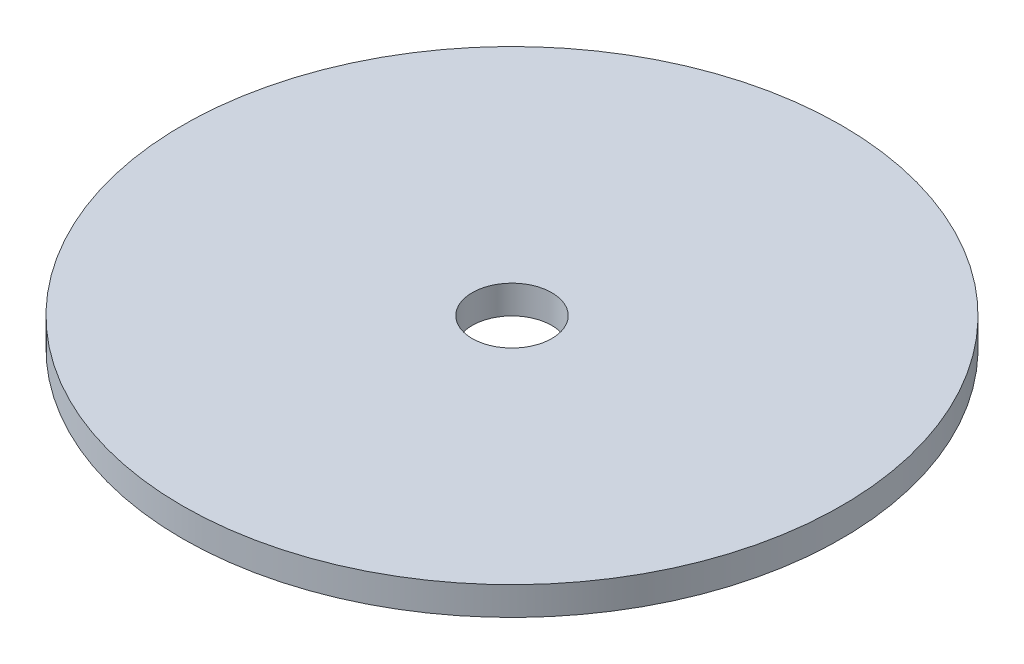
ISO-10303-21;
HEADER;
FILE_DESCRIPTION(('STEP AP214'),'2;1');
FILE_NAME('part.step','',(''),(''),'','','');
FILE_SCHEMA(('AUTOMOTIVE_DESIGN { 1 0 10303 214 1 1 1 1 }'));
ENDSEC;
DATA;
#1=APPLICATION_CONTEXT('core data for automotive mechanical design processes');
#2=APPLICATION_PROTOCOL_DEFINITION('international standard','automotive_design',2000,#1);
#3=PRODUCT_CONTEXT('',#1,'mechanical');
#4=PRODUCT('Part','Part','',(#3));
#5=PRODUCT_RELATED_PRODUCT_CATEGORY('part','',(#4));
#6=PRODUCT_DEFINITION_FORMATION('','',#4);
#7=PRODUCT_DEFINITION_CONTEXT('part definition',#1,'design');
#8=PRODUCT_DEFINITION('design','',#6,#7);
#9=PRODUCT_DEFINITION_SHAPE('','',#8);
#10=(LENGTH_UNIT() NAMED_UNIT(*) SI_UNIT(.MILLI.,.METRE.));
#11=(NAMED_UNIT(*) PLANE_ANGLE_UNIT() SI_UNIT($,.RADIAN.));
#12=(NAMED_UNIT(*) SI_UNIT($,.STERADIAN.) SOLID_ANGLE_UNIT());
#13=UNCERTAINTY_MEASURE_WITH_UNIT(LENGTH_MEASURE(1.E-05),#10,'distance_accuracy_value','');
#14=(GEOMETRIC_REPRESENTATION_CONTEXT(3) GLOBAL_UNCERTAINTY_ASSIGNED_CONTEXT((#13)) GLOBAL_UNIT_ASSIGNED_CONTEXT((#10,
#11,#12)) REPRESENTATION_CONTEXT('',''));
#15=CARTESIAN_POINT('',(0.,0.,0.));
#16=DIRECTION('',(0.,0.,1.));
#17=DIRECTION('',(1.,0.,0.));
#18=AXIS2_PLACEMENT_3D('',#15,#16,#17);
#19=CARTESIAN_POINT('',(0.,2.5,0.));
#20=DIRECTION('',(0.,1.,0.));
#21=DIRECTION('',(0.,0.,1.));
#22=AXIS2_PLACEMENT_3D('',#19,#20,#21);
#23=PLANE('',#22);
#24=CARTESIAN_POINT('',(0.,2.5,0.));
#25=DIRECTION('',(0.,1.,0.));
#26=DIRECTION('',(0.,0.,1.));
#27=AXIS2_PLACEMENT_3D('',#24,#25,#26);
#28=CIRCLE('',#27,29.);
#29=CARTESIAN_POINT('',(0.,2.5,29.));
#30=VERTEX_POINT('',#29);
#31=EDGE_CURVE('E10',#30,#30,#28,.T.);
#32=ORIENTED_EDGE('',*,*,#31,.T.);
#33=EDGE_LOOP('',(#32));
#34=FACE_BOUND('',#33,.T.);
#35=CARTESIAN_POINT('',(0.,2.5,0.));
#36=DIRECTION('',(0.,1.,0.));
#37=DIRECTION('',(0.,0.,1.));
#38=AXIS2_PLACEMENT_3D('',#35,#36,#37);
#39=CIRCLE('',#38,3.5);
#40=CARTESIAN_POINT('',(0.,2.5,3.5));
#41=VERTEX_POINT('',#40);
#42=EDGE_CURVE('E45',#41,#41,#39,.T.);
#43=ORIENTED_EDGE('',*,*,#42,.F.);
#44=EDGE_LOOP('',(#43));
#45=FACE_BOUND('',#44,.T.);
#46=ADVANCED_FACE('F34',(#34,#45),#23,.T.);
#47=CARTESIAN_POINT('',(0.,0.,0.));
#48=DIRECTION('',(0.,1.,0.));
#49=DIRECTION('',(0.,0.,1.));
#50=AXIS2_PLACEMENT_3D('',#47,#48,#49);
#51=PLANE('',#50);
#52=CARTESIAN_POINT('',(0.,0.,0.));
#53=DIRECTION('',(0.,1.,0.));
#54=DIRECTION('',(0.,0.,1.));
#55=AXIS2_PLACEMENT_3D('',#52,#53,#54);
#56=CIRCLE('',#55,29.);
#57=CARTESIAN_POINT('',(0.,0.,29.));
#58=VERTEX_POINT('',#57);
#59=EDGE_CURVE('E38',#58,#58,#56,.T.);
#60=ORIENTED_EDGE('',*,*,#59,.F.);
#61=EDGE_LOOP('',(#60));
#62=FACE_BOUND('',#61,.T.);
#63=CARTESIAN_POINT('',(0.,0.,0.));
#64=DIRECTION('',(0.,1.,0.));
#65=DIRECTION('',(0.,0.,1.));
#66=AXIS2_PLACEMENT_3D('',#63,#64,#65);
#67=CIRCLE('',#66,3.5);
#68=CARTESIAN_POINT('',(0.,0.,3.5));
#69=VERTEX_POINT('',#68);
#70=EDGE_CURVE('E47',#69,#69,#67,.T.);
#71=ORIENTED_EDGE('',*,*,#70,.T.);
#72=EDGE_LOOP('',(#71));
#73=FACE_BOUND('',#72,.T.);
#74=ADVANCED_FACE('F57',(#62,#73),#51,.F.);
#75=CARTESIAN_POINT('',(0.,2.5,0.));
#76=DIRECTION('',(0.,-1.,0.));
#77=DIRECTION('',(0.,0.,-1.));
#78=AXIS2_PLACEMENT_3D('',#75,#76,#77);
#79=CYLINDRICAL_SURFACE('',#78,29.);
#80=ORIENTED_EDGE('',*,*,#31,.F.);
#81=EDGE_LOOP('',(#80));
#82=FACE_BOUND('',#81,.T.);
#83=ORIENTED_EDGE('',*,*,#59,.T.);
#84=EDGE_LOOP('',(#83));
#85=FACE_BOUND('',#84,.T.);
#86=ADVANCED_FACE('F36',(#82,#85),#79,.T.);
#87=CARTESIAN_POINT('',(0.,2.5,0.));
#88=DIRECTION('',(0.,-1.,0.));
#89=DIRECTION('',(0.,0.,-1.));
#90=AXIS2_PLACEMENT_3D('',#87,#88,#89);
#91=CYLINDRICAL_SURFACE('',#90,3.5);
#92=ORIENTED_EDGE('',*,*,#42,.T.);
#93=EDGE_LOOP('',(#92));
#94=FACE_BOUND('',#93,.T.);
#95=ORIENTED_EDGE('',*,*,#70,.F.);
#96=EDGE_LOOP('',(#95));
#97=FACE_BOUND('',#96,.T.);
#98=ADVANCED_FACE('F53',(#94,#97),#91,.F.);
#99=CLOSED_SHELL('',(#46,#74,#86,#98));
#100=MANIFOLD_SOLID_BREP('B2',#99);
#101=ADVANCED_BREP_SHAPE_REPRESENTATION('',(#18,#100),#14);
#102=SHAPE_DEFINITION_REPRESENTATION(#9,#101);
ENDSEC;
END-ISO-10303-21;
